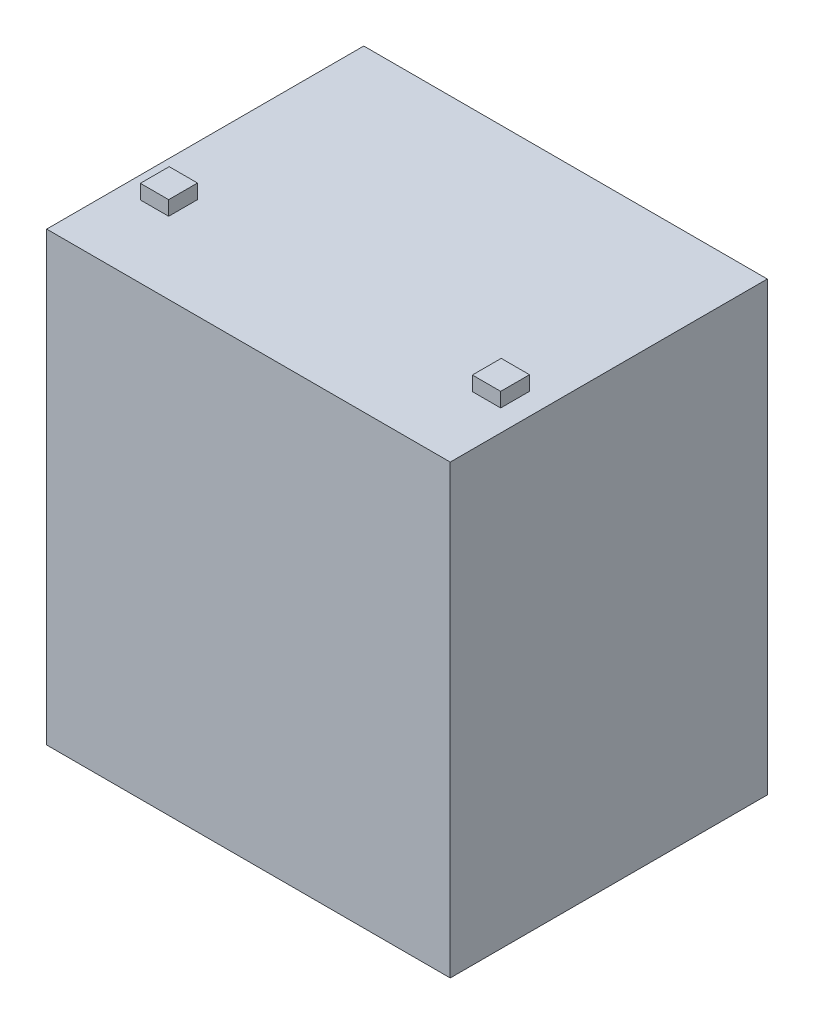
ISO-10303-21;
HEADER;
FILE_DESCRIPTION(('STEP AP214'),'2;1');
FILE_NAME('part.step','',(''),(''),'','','');
FILE_SCHEMA(('AUTOMOTIVE_DESIGN { 1 0 10303 214 1 1 1 1 }'));
ENDSEC;
DATA;
#1=APPLICATION_CONTEXT('core data for automotive mechanical design processes');
#2=APPLICATION_PROTOCOL_DEFINITION('international standard','automotive_design',2000,#1);
#3=PRODUCT_CONTEXT('',#1,'mechanical');
#4=PRODUCT('Part','Part','',(#3));
#5=PRODUCT_RELATED_PRODUCT_CATEGORY('part','',(#4));
#6=PRODUCT_DEFINITION_FORMATION('','',#4);
#7=PRODUCT_DEFINITION_CONTEXT('part definition',#1,'design');
#8=PRODUCT_DEFINITION('design','',#6,#7);
#9=PRODUCT_DEFINITION_SHAPE('','',#8);
#10=(LENGTH_UNIT() NAMED_UNIT(*) SI_UNIT(.MILLI.,.METRE.));
#11=(NAMED_UNIT(*) PLANE_ANGLE_UNIT() SI_UNIT($,.RADIAN.));
#12=(NAMED_UNIT(*) SI_UNIT($,.STERADIAN.) SOLID_ANGLE_UNIT());
#13=UNCERTAINTY_MEASURE_WITH_UNIT(LENGTH_MEASURE(1.E-05),#10,'distance_accuracy_value','');
#14=(GEOMETRIC_REPRESENTATION_CONTEXT(3) GLOBAL_UNCERTAINTY_ASSIGNED_CONTEXT((#13)) GLOBAL_UNIT_ASSIGNED_CONTEXT((#10,
#11,#12)) REPRESENTATION_CONTEXT('',''));
#15=CARTESIAN_POINT('',(0.,0.,0.));
#16=DIRECTION('',(0.,0.,1.));
#17=DIRECTION('',(1.,0.,0.));
#18=AXIS2_PLACEMENT_3D('',#15,#16,#17);
#19=CARTESIAN_POINT('',(-44.45,49.2125,-69.85));
#20=DIRECTION('',(0.,1.,0.));
#21=DIRECTION('',(0.,0.,1.));
#22=AXIS2_PLACEMENT_3D('',#19,#20,#21);
#23=PLANE('',#22);
#24=DIRECTION('',(1.,0.,0.));
#25=VECTOR('',#24,1.);
#26=CARTESIAN_POINT('',(-39.6875,49.2125,-15.875));
#27=LINE('',#26,#25);
#28=CARTESIAN_POINT('',(-39.6875,49.2125,-15.875));
#29=VERTEX_POINT('',#28);
#30=CARTESIAN_POINT('',(-33.4516725081221,49.2125,-15.875));
#31=VERTEX_POINT('',#30);
#32=EDGE_CURVE('E152',#29,#31,#27,.T.);
#33=ORIENTED_EDGE('',*,*,#32,.F.);
#34=DIRECTION('',(0.,0.,1.));
#35=VECTOR('',#34,1.);
#36=CARTESIAN_POINT('',(-39.6875,49.2125,-15.875));
#37=LINE('',#36,#35);
#38=CARTESIAN_POINT('',(-39.6875,49.2125,-22.225));
#39=VERTEX_POINT('',#38);
#40=EDGE_CURVE('E149',#39,#29,#37,.T.);
#41=ORIENTED_EDGE('',*,*,#40,.F.);
#42=DIRECTION('',(-1.,0.,0.));
#43=VECTOR('',#42,1.);
#44=CARTESIAN_POINT('',(-39.6875,49.2125,-22.225));
#45=LINE('',#44,#43);
#46=CARTESIAN_POINT('',(-33.4516725081221,49.2125,-22.225));
#47=VERTEX_POINT('',#46);
#48=EDGE_CURVE('E161',#47,#39,#45,.T.);
#49=ORIENTED_EDGE('',*,*,#48,.F.);
#50=DIRECTION('',(0.,0.,-1.));
#51=VECTOR('',#50,1.);
#52=CARTESIAN_POINT('',(-33.4516725081221,49.2125,-15.875));
#53=LINE('',#52,#51);
#54=EDGE_CURVE('E169',#31,#47,#53,.T.);
#55=ORIENTED_EDGE('',*,*,#54,.F.);
#56=EDGE_LOOP('',(#33,#41,#49,#55));
#57=FACE_BOUND('',#56,.T.);
#58=DIRECTION('',(-1.,0.,0.));
#59=VECTOR('',#58,1.);
#60=CARTESIAN_POINT('',(-44.45,49.2125,0.));
#61=LINE('',#60,#59);
#62=CARTESIAN_POINT('',(44.45,49.2125,0.));
#63=VERTEX_POINT('',#62);
#64=CARTESIAN_POINT('',(-44.45,49.2125,0.));
#65=VERTEX_POINT('',#64);
#66=EDGE_CURVE('E196',#63,#65,#61,.T.);
#67=ORIENTED_EDGE('',*,*,#66,.F.);
#68=DIRECTION('',(0.,0.,1.));
#69=VECTOR('',#68,1.);
#70=CARTESIAN_POINT('',(44.45,49.2125,-69.85));
#71=LINE('',#70,#69);
#72=CARTESIAN_POINT('',(44.45,49.2125,-69.85));
#73=VERTEX_POINT('',#72);
#74=EDGE_CURVE('E37',#73,#63,#71,.T.);
#75=ORIENTED_EDGE('',*,*,#74,.F.);
#76=DIRECTION('',(-1.,0.,0.));
#77=VECTOR('',#76,1.);
#78=CARTESIAN_POINT('',(-44.45,49.2125,-69.85));
#79=LINE('',#78,#77);
#80=CARTESIAN_POINT('',(-44.45,49.2125,-69.85));
#81=VERTEX_POINT('',#80);
#82=EDGE_CURVE('E184',#73,#81,#79,.T.);
#83=ORIENTED_EDGE('',*,*,#82,.T.);
#84=DIRECTION('',(0.,0.,1.));
#85=VECTOR('',#84,1.);
#86=CARTESIAN_POINT('',(-44.45,49.2125,-69.85));
#87=LINE('',#86,#85);
#88=EDGE_CURVE('E204',#81,#65,#87,.T.);
#89=ORIENTED_EDGE('',*,*,#88,.T.);
#90=EDGE_LOOP('',(#67,#75,#83,#89));
#91=FACE_BOUND('',#90,.T.);
#92=DIRECTION('',(-1.,0.,0.));
#93=VECTOR('',#92,1.);
#94=CARTESIAN_POINT('',(39.6875,49.2125,-22.225));
#95=LINE('',#94,#93);
#96=CARTESIAN_POINT('',(39.6875,49.2125,-22.225));
#97=VERTEX_POINT('',#96);
#98=CARTESIAN_POINT('',(33.4516725081221,49.2125,-22.225));
#99=VERTEX_POINT('',#98);
#100=EDGE_CURVE('E348',#97,#99,#95,.T.);
#101=ORIENTED_EDGE('',*,*,#100,.F.);
#102=DIRECTION('',(0.,0.,-1.));
#103=VECTOR('',#102,1.);
#104=CARTESIAN_POINT('',(39.6875,49.2125,-15.875));
#105=LINE('',#104,#103);
#106=CARTESIAN_POINT('',(39.6875,49.2125,-15.875));
#107=VERTEX_POINT('',#106);
#108=EDGE_CURVE('E147',#107,#97,#105,.T.);
#109=ORIENTED_EDGE('',*,*,#108,.F.);
#110=DIRECTION('',(1.,0.,0.));
#111=VECTOR('',#110,1.);
#112=CARTESIAN_POINT('',(39.6875,49.2125,-15.875));
#113=LINE('',#112,#111);
#114=CARTESIAN_POINT('',(33.4516725081221,49.2125,-15.875));
#115=VERTEX_POINT('',#114);
#116=EDGE_CURVE('E143',#115,#107,#113,.T.);
#117=ORIENTED_EDGE('',*,*,#116,.F.);
#118=DIRECTION('',(0.,0.,1.));
#119=VECTOR('',#118,1.);
#120=CARTESIAN_POINT('',(33.4516725081221,49.2125,-15.875));
#121=LINE('',#120,#119);
#122=EDGE_CURVE('E345',#99,#115,#121,.T.);
#123=ORIENTED_EDGE('',*,*,#122,.F.);
#124=EDGE_LOOP('',(#101,#109,#117,#123));
#125=FACE_BOUND('',#124,.T.);
#126=ADVANCED_FACE('F33',(#57,#91,#125),#23,.T.);
#127=CARTESIAN_POINT('',(44.45,-49.2125,-69.85));
#128=DIRECTION('',(1.,0.,0.));
#129=DIRECTION('',(0.,0.,-1.));
#130=AXIS2_PLACEMENT_3D('',#127,#128,#129);
#131=PLANE('',#130);
#132=DIRECTION('',(0.,1.,0.));
#133=VECTOR('',#132,1.);
#134=CARTESIAN_POINT('',(44.45,-49.2125,0.));
#135=LINE('',#134,#133);
#136=CARTESIAN_POINT('',(44.45,-49.2125,0.));
#137=VERTEX_POINT('',#136);
#138=EDGE_CURVE('E180',#137,#63,#135,.T.);
#139=ORIENTED_EDGE('',*,*,#138,.F.);
#140=DIRECTION('',(0.,0.,1.));
#141=VECTOR('',#140,1.);
#142=CARTESIAN_POINT('',(44.45,-49.2125,-69.85));
#143=LINE('',#142,#141);
#144=CARTESIAN_POINT('',(44.45,-49.2125,-69.85));
#145=VERTEX_POINT('',#144);
#146=EDGE_CURVE('E11',#145,#137,#143,.T.);
#147=ORIENTED_EDGE('',*,*,#146,.F.);
#148=DIRECTION('',(0.,1.,0.));
#149=VECTOR('',#148,1.);
#150=CARTESIAN_POINT('',(44.45,-49.2125,-69.85));
#151=LINE('',#150,#149);
#152=EDGE_CURVE('E181',#145,#73,#151,.T.);
#153=ORIENTED_EDGE('',*,*,#152,.T.);
#154=ORIENTED_EDGE('',*,*,#74,.T.);
#155=EDGE_LOOP('',(#139,#147,#153,#154));
#156=FACE_BOUND('',#155,.T.);
#157=ADVANCED_FACE('F35',(#156),#131,.T.);
#158=CARTESIAN_POINT('',(-44.45,-49.2125,-69.85));
#159=DIRECTION('',(0.,-1.,0.));
#160=DIRECTION('',(0.,0.,-1.));
#161=AXIS2_PLACEMENT_3D('',#158,#159,#160);
#162=PLANE('',#161);
#163=DIRECTION('',(1.,0.,0.));
#164=VECTOR('',#163,1.);
#165=CARTESIAN_POINT('',(-44.45,-49.2125,0.));
#166=LINE('',#165,#164);
#167=CARTESIAN_POINT('',(-44.45,-49.2125,0.));
#168=VERTEX_POINT('',#167);
#169=EDGE_CURVE('E185',#168,#137,#166,.T.);
#170=ORIENTED_EDGE('',*,*,#169,.F.);
#171=DIRECTION('',(0.,0.,1.));
#172=VECTOR('',#171,1.);
#173=CARTESIAN_POINT('',(-44.45,-49.2125,-69.85));
#174=LINE('',#173,#172);
#175=CARTESIAN_POINT('',(-44.45,-49.2125,-69.85));
#176=VERTEX_POINT('',#175);
#177=EDGE_CURVE('E42',#176,#168,#174,.T.);
#178=ORIENTED_EDGE('',*,*,#177,.F.);
#179=DIRECTION('',(1.,0.,0.));
#180=VECTOR('',#179,1.);
#181=CARTESIAN_POINT('',(-44.45,-49.2125,-69.85));
#182=LINE('',#181,#180);
#183=EDGE_CURVE('E191',#176,#145,#182,.T.);
#184=ORIENTED_EDGE('',*,*,#183,.T.);
#185=ORIENTED_EDGE('',*,*,#146,.T.);
#186=EDGE_LOOP('',(#170,#178,#184,#185));
#187=FACE_BOUND('',#186,.T.);
#188=ADVANCED_FACE('F217',(#187),#162,.T.);
#189=CARTESIAN_POINT('',(-44.45,-49.2125,-69.85));
#190=DIRECTION('',(-1.,0.,0.));
#191=DIRECTION('',(0.,0.,1.));
#192=AXIS2_PLACEMENT_3D('',#189,#190,#191);
#193=PLANE('',#192);
#194=DIRECTION('',(0.,-1.,0.));
#195=VECTOR('',#194,1.);
#196=CARTESIAN_POINT('',(-44.45,-49.2125,0.));
#197=LINE('',#196,#195);
#198=EDGE_CURVE('E199',#65,#168,#197,.T.);
#199=ORIENTED_EDGE('',*,*,#198,.F.);
#200=ORIENTED_EDGE('',*,*,#88,.F.);
#201=DIRECTION('',(0.,-1.,0.));
#202=VECTOR('',#201,1.);
#203=CARTESIAN_POINT('',(-44.45,-49.2125,-69.85));
#204=LINE('',#203,#202);
#205=EDGE_CURVE('E188',#81,#176,#204,.T.);
#206=ORIENTED_EDGE('',*,*,#205,.T.);
#207=ORIENTED_EDGE('',*,*,#177,.T.);
#208=EDGE_LOOP('',(#199,#200,#206,#207));
#209=FACE_BOUND('',#208,.T.);
#210=ADVANCED_FACE('F223',(#209),#193,.T.);
#211=CARTESIAN_POINT('',(0.,0.,-69.85));
#212=DIRECTION('',(0.,0.,-1.));
#213=DIRECTION('',(-1.,0.,0.));
#214=AXIS2_PLACEMENT_3D('',#211,#212,#213);
#215=PLANE('',#214);
#216=ORIENTED_EDGE('',*,*,#152,.F.);
#217=ORIENTED_EDGE('',*,*,#183,.F.);
#218=ORIENTED_EDGE('',*,*,#205,.F.);
#219=ORIENTED_EDGE('',*,*,#82,.F.);
#220=EDGE_LOOP('',(#216,#217,#218,#219));
#221=FACE_BOUND('',#220,.T.);
#222=ADVANCED_FACE('F220',(#221),#215,.T.);
#223=CARTESIAN_POINT('',(0.,0.,0.));
#224=DIRECTION('',(0.,0.,-1.));
#225=DIRECTION('',(-1.,0.,0.));
#226=AXIS2_PLACEMENT_3D('',#223,#224,#225);
#227=PLANE('',#226);
#228=ORIENTED_EDGE('',*,*,#138,.T.);
#229=ORIENTED_EDGE('',*,*,#66,.T.);
#230=ORIENTED_EDGE('',*,*,#198,.T.);
#231=ORIENTED_EDGE('',*,*,#169,.T.);
#232=EDGE_LOOP('',(#228,#229,#230,#231));
#233=FACE_BOUND('',#232,.T.);
#234=ADVANCED_FACE('F214',(#233),#227,.F.);
#235=CARTESIAN_POINT('',(-39.6875,52.3875,-15.875));
#236=DIRECTION('',(1.,0.,0.));
#237=DIRECTION('',(0.,0.,-1.));
#238=AXIS2_PLACEMENT_3D('',#235,#236,#237);
#239=PLANE('',#238);
#240=ORIENTED_EDGE('',*,*,#40,.T.);
#241=DIRECTION('',(0.,-1.,0.));
#242=VECTOR('',#241,1.);
#243=CARTESIAN_POINT('',(-39.6875,52.3875,-15.875));
#244=LINE('',#243,#242);
#245=CARTESIAN_POINT('',(-39.6875,52.3875,-15.875));
#246=VERTEX_POINT('',#245);
#247=EDGE_CURVE('E178',#246,#29,#244,.T.);
#248=ORIENTED_EDGE('',*,*,#247,.F.);
#249=DIRECTION('',(0.,0.,1.));
#250=VECTOR('',#249,1.);
#251=CARTESIAN_POINT('',(-39.6875,52.3875,-15.875));
#252=LINE('',#251,#250);
#253=CARTESIAN_POINT('',(-39.6875,52.3875,-22.225));
#254=VERTEX_POINT('',#253);
#255=EDGE_CURVE('E157',#254,#246,#252,.T.);
#256=ORIENTED_EDGE('',*,*,#255,.F.);
#257=DIRECTION('',(0.,-1.,0.));
#258=VECTOR('',#257,1.);
#259=CARTESIAN_POINT('',(-39.6875,52.3875,-22.225));
#260=LINE('',#259,#258);
#261=EDGE_CURVE('E166',#254,#39,#260,.T.);
#262=ORIENTED_EDGE('',*,*,#261,.T.);
#263=EDGE_LOOP('',(#240,#248,#256,#262));
#264=FACE_BOUND('',#263,.T.);
#265=ADVANCED_FACE('F253',(#264),#239,.F.);
#266=CARTESIAN_POINT('',(-39.6875,52.3875,-15.875));
#267=DIRECTION('',(0.,0.,-1.));
#268=DIRECTION('',(-1.,0.,0.));
#269=AXIS2_PLACEMENT_3D('',#266,#267,#268);
#270=PLANE('',#269);
#271=ORIENTED_EDGE('',*,*,#32,.T.);
#272=DIRECTION('',(0.,-1.,0.));
#273=VECTOR('',#272,1.);
#274=CARTESIAN_POINT('',(-33.4516725081221,52.3875,-15.875));
#275=LINE('',#274,#273);
#276=CARTESIAN_POINT('',(-33.4516725081221,52.3875,-15.875));
#277=VERTEX_POINT('',#276);
#278=EDGE_CURVE('E175',#277,#31,#275,.T.);
#279=ORIENTED_EDGE('',*,*,#278,.F.);
#280=DIRECTION('',(1.,0.,0.));
#281=VECTOR('',#280,1.);
#282=CARTESIAN_POINT('',(-39.6875,52.3875,-15.875));
#283=LINE('',#282,#281);
#284=EDGE_CURVE('E160',#246,#277,#283,.T.);
#285=ORIENTED_EDGE('',*,*,#284,.F.);
#286=ORIENTED_EDGE('',*,*,#247,.T.);
#287=EDGE_LOOP('',(#271,#279,#285,#286));
#288=FACE_BOUND('',#287,.T.);
#289=ADVANCED_FACE('F243',(#288),#270,.F.);
#290=CARTESIAN_POINT('',(-33.4516725081221,52.3875,-15.875));
#291=DIRECTION('',(-1.,0.,0.));
#292=DIRECTION('',(0.,0.,1.));
#293=AXIS2_PLACEMENT_3D('',#290,#291,#292);
#294=PLANE('',#293);
#295=ORIENTED_EDGE('',*,*,#54,.T.);
#296=DIRECTION('',(0.,-1.,0.));
#297=VECTOR('',#296,1.);
#298=CARTESIAN_POINT('',(-33.4516725081221,52.3875,-22.225));
#299=LINE('',#298,#297);
#300=CARTESIAN_POINT('',(-33.4516725081221,52.3875,-22.225));
#301=VERTEX_POINT('',#300);
#302=EDGE_CURVE('E58',#301,#47,#299,.T.);
#303=ORIENTED_EDGE('',*,*,#302,.F.);
#304=DIRECTION('',(0.,0.,-1.));
#305=VECTOR('',#304,1.);
#306=CARTESIAN_POINT('',(-33.4516725081221,52.3875,-15.875));
#307=LINE('',#306,#305);
#308=EDGE_CURVE('E163',#277,#301,#307,.T.);
#309=ORIENTED_EDGE('',*,*,#308,.F.);
#310=ORIENTED_EDGE('',*,*,#278,.T.);
#311=EDGE_LOOP('',(#295,#303,#309,#310));
#312=FACE_BOUND('',#311,.T.);
#313=ADVANCED_FACE('F247',(#312),#294,.F.);
#314=CARTESIAN_POINT('',(-39.6875,52.3875,-22.225));
#315=DIRECTION('',(0.,0.,1.));
#316=DIRECTION('',(1.,0.,0.));
#317=AXIS2_PLACEMENT_3D('',#314,#315,#316);
#318=PLANE('',#317);
#319=ORIENTED_EDGE('',*,*,#48,.T.);
#320=ORIENTED_EDGE('',*,*,#261,.F.);
#321=DIRECTION('',(-1.,0.,0.));
#322=VECTOR('',#321,1.);
#323=CARTESIAN_POINT('',(-39.6875,52.3875,-22.225));
#324=LINE('',#323,#322);
#325=EDGE_CURVE('E165',#301,#254,#324,.T.);
#326=ORIENTED_EDGE('',*,*,#325,.F.);
#327=ORIENTED_EDGE('',*,*,#302,.T.);
#328=EDGE_LOOP('',(#319,#320,#326,#327));
#329=FACE_BOUND('',#328,.T.);
#330=ADVANCED_FACE('F254',(#329),#318,.F.);
#331=CARTESIAN_POINT('',(0.,52.3875,0.));
#332=DIRECTION('',(0.,-1.,0.));
#333=DIRECTION('',(0.,0.,-1.));
#334=AXIS2_PLACEMENT_3D('',#331,#332,#333);
#335=PLANE('',#334);
#336=ORIENTED_EDGE('',*,*,#255,.T.);
#337=ORIENTED_EDGE('',*,*,#284,.T.);
#338=ORIENTED_EDGE('',*,*,#308,.T.);
#339=ORIENTED_EDGE('',*,*,#325,.T.);
#340=EDGE_LOOP('',(#336,#337,#338,#339));
#341=FACE_BOUND('',#340,.T.);
#342=ADVANCED_FACE('F249',(#341),#335,.F.);
#343=CARTESIAN_POINT('',(39.6875,52.3875,-15.875));
#344=DIRECTION('',(-1.,0.,0.));
#345=DIRECTION('',(0.,0.,1.));
#346=AXIS2_PLACEMENT_3D('',#343,#344,#345);
#347=PLANE('',#346);
#348=ORIENTED_EDGE('',*,*,#108,.T.);
#349=DIRECTION('',(0.,-1.,0.));
#350=VECTOR('',#349,1.);
#351=CARTESIAN_POINT('',(39.6875,52.3875,-22.225));
#352=LINE('',#351,#350);
#353=CARTESIAN_POINT('',(39.6875,52.3875,-22.225));
#354=VERTEX_POINT('',#353);
#355=EDGE_CURVE('E128',#354,#97,#352,.T.);
#356=ORIENTED_EDGE('',*,*,#355,.F.);
#357=DIRECTION('',(0.,0.,-1.));
#358=VECTOR('',#357,1.);
#359=CARTESIAN_POINT('',(39.6875,52.3875,-15.875));
#360=LINE('',#359,#358);
#361=CARTESIAN_POINT('',(39.6875,52.3875,-15.875));
#362=VERTEX_POINT('',#361);
#363=EDGE_CURVE('E135',#362,#354,#360,.T.);
#364=ORIENTED_EDGE('',*,*,#363,.F.);
#365=DIRECTION('',(0.,-1.,0.));
#366=VECTOR('',#365,1.);
#367=CARTESIAN_POINT('',(39.6875,52.3875,-15.875));
#368=LINE('',#367,#366);
#369=EDGE_CURVE('E343',#362,#107,#368,.T.);
#370=ORIENTED_EDGE('',*,*,#369,.T.);
#371=EDGE_LOOP('',(#348,#356,#364,#370));
#372=FACE_BOUND('',#371,.T.);
#373=ADVANCED_FACE('F145',(#372),#347,.F.);
#374=CARTESIAN_POINT('',(39.6875,52.3875,-22.225));
#375=DIRECTION('',(0.,0.,1.));
#376=DIRECTION('',(1.,0.,0.));
#377=AXIS2_PLACEMENT_3D('',#374,#375,#376);
#378=PLANE('',#377);
#379=ORIENTED_EDGE('',*,*,#100,.T.);
#380=DIRECTION('',(0.,-1.,0.));
#381=VECTOR('',#380,1.);
#382=CARTESIAN_POINT('',(33.4516725081221,52.3875,-22.225));
#383=LINE('',#382,#381);
#384=CARTESIAN_POINT('',(33.4516725081221,52.3875,-22.225));
#385=VERTEX_POINT('',#384);
#386=EDGE_CURVE('E131',#385,#99,#383,.T.);
#387=ORIENTED_EDGE('',*,*,#386,.F.);
#388=DIRECTION('',(-1.,0.,0.));
#389=VECTOR('',#388,1.);
#390=CARTESIAN_POINT('',(39.6875,52.3875,-22.225));
#391=LINE('',#390,#389);
#392=EDGE_CURVE('E124',#354,#385,#391,.T.);
#393=ORIENTED_EDGE('',*,*,#392,.F.);
#394=ORIENTED_EDGE('',*,*,#355,.T.);
#395=EDGE_LOOP('',(#379,#387,#393,#394));
#396=FACE_BOUND('',#395,.T.);
#397=ADVANCED_FACE('F126',(#396),#378,.F.);
#398=CARTESIAN_POINT('',(33.4516725081221,52.3875,-15.875));
#399=DIRECTION('',(1.,0.,0.));
#400=DIRECTION('',(0.,0.,-1.));
#401=AXIS2_PLACEMENT_3D('',#398,#399,#400);
#402=PLANE('',#401);
#403=ORIENTED_EDGE('',*,*,#122,.T.);
#404=DIRECTION('',(0.,-1.,0.));
#405=VECTOR('',#404,1.);
#406=CARTESIAN_POINT('',(33.4516725081221,52.3875,-15.875));
#407=LINE('',#406,#405);
#408=CARTESIAN_POINT('',(33.4516725081221,52.3875,-15.875));
#409=VERTEX_POINT('',#408);
#410=EDGE_CURVE('E50',#409,#115,#407,.T.);
#411=ORIENTED_EDGE('',*,*,#410,.F.);
#412=DIRECTION('',(0.,0.,1.));
#413=VECTOR('',#412,1.);
#414=CARTESIAN_POINT('',(33.4516725081221,52.3875,-15.875));
#415=LINE('',#414,#413);
#416=EDGE_CURVE('E134',#385,#409,#415,.T.);
#417=ORIENTED_EDGE('',*,*,#416,.F.);
#418=ORIENTED_EDGE('',*,*,#386,.T.);
#419=EDGE_LOOP('',(#403,#411,#417,#418));
#420=FACE_BOUND('',#419,.T.);
#421=ADVANCED_FACE('F312',(#420),#402,.F.);
#422=CARTESIAN_POINT('',(39.6875,52.3875,-15.875));
#423=DIRECTION('',(0.,0.,-1.));
#424=DIRECTION('',(-1.,0.,0.));
#425=AXIS2_PLACEMENT_3D('',#422,#423,#424);
#426=PLANE('',#425);
#427=ORIENTED_EDGE('',*,*,#116,.T.);
#428=ORIENTED_EDGE('',*,*,#369,.F.);
#429=DIRECTION('',(1.,0.,0.));
#430=VECTOR('',#429,1.);
#431=CARTESIAN_POINT('',(39.6875,52.3875,-15.875));
#432=LINE('',#431,#430);
#433=EDGE_CURVE('E139',#409,#362,#432,.T.);
#434=ORIENTED_EDGE('',*,*,#433,.F.);
#435=ORIENTED_EDGE('',*,*,#410,.T.);
#436=EDGE_LOOP('',(#427,#428,#434,#435));
#437=FACE_BOUND('',#436,.T.);
#438=ADVANCED_FACE('F321',(#437),#426,.F.);
#439=CARTESIAN_POINT('',(0.,52.3875,0.));
#440=DIRECTION('',(0.,1.,0.));
#441=DIRECTION('',(0.,0.,1.));
#442=AXIS2_PLACEMENT_3D('',#439,#440,#441);
#443=PLANE('',#442);
#444=ORIENTED_EDGE('',*,*,#363,.T.);
#445=ORIENTED_EDGE('',*,*,#392,.T.);
#446=ORIENTED_EDGE('',*,*,#416,.T.);
#447=ORIENTED_EDGE('',*,*,#433,.T.);
#448=EDGE_LOOP('',(#444,#445,#446,#447));
#449=FACE_BOUND('',#448,.T.);
#450=ADVANCED_FACE('F138',(#449),#443,.T.);
#451=CLOSED_SHELL('',(#126,#157,#188,#210,#222,#234,#265,#289,#313,#330,#342,#373,#397,#421,
#438,#450));
#452=MANIFOLD_SOLID_BREP('B2',#451);
#453=ADVANCED_BREP_SHAPE_REPRESENTATION('',(#18,#452),#14);
#454=SHAPE_DEFINITION_REPRESENTATION(#9,#453);
ENDSEC;
END-ISO-10303-21;
